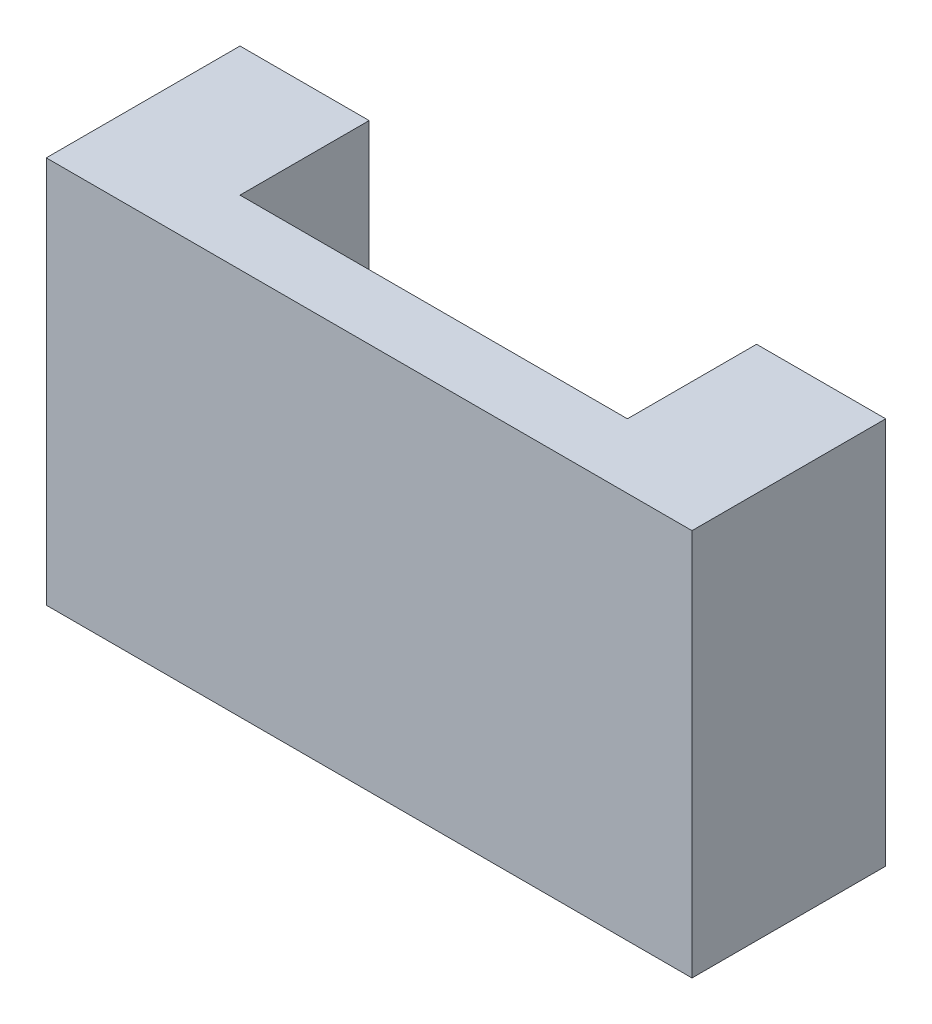
ISO-10303-21;
HEADER;
FILE_DESCRIPTION(('STEP AP214'),'2;1');
FILE_NAME('part.step','',(''),(''),'','','');
FILE_SCHEMA(('AUTOMOTIVE_DESIGN { 1 0 10303 214 1 1 1 1 }'));
ENDSEC;
DATA;
#1=APPLICATION_CONTEXT('core data for automotive mechanical design processes');
#2=APPLICATION_PROTOCOL_DEFINITION('international standard','automotive_design',2000,#1);
#3=PRODUCT_CONTEXT('',#1,'mechanical');
#4=PRODUCT('Part','Part','',(#3));
#5=PRODUCT_RELATED_PRODUCT_CATEGORY('part','',(#4));
#6=PRODUCT_DEFINITION_FORMATION('','',#4);
#7=PRODUCT_DEFINITION_CONTEXT('part definition',#1,'design');
#8=PRODUCT_DEFINITION('design','',#6,#7);
#9=PRODUCT_DEFINITION_SHAPE('','',#8);
#10=(LENGTH_UNIT() NAMED_UNIT(*) SI_UNIT(.MILLI.,.METRE.));
#11=(NAMED_UNIT(*) PLANE_ANGLE_UNIT() SI_UNIT($,.RADIAN.));
#12=(NAMED_UNIT(*) SI_UNIT($,.STERADIAN.) SOLID_ANGLE_UNIT());
#13=UNCERTAINTY_MEASURE_WITH_UNIT(LENGTH_MEASURE(1.E-05),#10,'distance_accuracy_value','');
#14=(GEOMETRIC_REPRESENTATION_CONTEXT(3) GLOBAL_UNCERTAINTY_ASSIGNED_CONTEXT((#13)) GLOBAL_UNIT_ASSIGNED_CONTEXT((#10,
#11,#12)) REPRESENTATION_CONTEXT('',''));
#15=CARTESIAN_POINT('',(0.,0.,0.));
#16=DIRECTION('',(0.,0.,1.));
#17=DIRECTION('',(1.,0.,0.));
#18=AXIS2_PLACEMENT_3D('',#15,#16,#17);
#19=CARTESIAN_POINT('',(-25.,30.,0.));
#20=DIRECTION('',(1.,0.,0.));
#21=DIRECTION('',(0.,0.,-1.));
#22=AXIS2_PLACEMENT_3D('',#19,#20,#21);
#23=PLANE('',#22);
#24=DIRECTION('',(0.,0.,1.));
#25=VECTOR('',#24,1.);
#26=CARTESIAN_POINT('',(-25.,0.,0.));
#27=LINE('',#26,#25);
#28=CARTESIAN_POINT('',(-25.,0.,0.));
#29=VERTEX_POINT('',#28);
#30=CARTESIAN_POINT('',(-25.,0.,15.));
#31=VERTEX_POINT('',#30);
#32=EDGE_CURVE('E140',#29,#31,#27,.T.);
#33=ORIENTED_EDGE('',*,*,#32,.T.);
#34=DIRECTION('',(0.,-1.,0.));
#35=VECTOR('',#34,1.);
#36=CARTESIAN_POINT('',(-25.,30.,15.));
#37=LINE('',#36,#35);
#38=CARTESIAN_POINT('',(-25.,30.,15.));
#39=VERTEX_POINT('',#38);
#40=EDGE_CURVE('E11',#39,#31,#37,.T.);
#41=ORIENTED_EDGE('',*,*,#40,.F.);
#42=DIRECTION('',(0.,0.,1.));
#43=VECTOR('',#42,1.);
#44=CARTESIAN_POINT('',(-25.,30.,0.));
#45=LINE('',#44,#43);
#46=CARTESIAN_POINT('',(-25.,30.,0.));
#47=VERTEX_POINT('',#46);
#48=EDGE_CURVE('E162',#47,#39,#45,.T.);
#49=ORIENTED_EDGE('',*,*,#48,.F.);
#50=DIRECTION('',(0.,-1.,0.));
#51=VECTOR('',#50,1.);
#52=CARTESIAN_POINT('',(-25.,30.,0.));
#53=LINE('',#52,#51);
#54=EDGE_CURVE('E136',#47,#29,#53,.T.);
#55=ORIENTED_EDGE('',*,*,#54,.T.);
#56=EDGE_LOOP('',(#33,#41,#49,#55));
#57=FACE_BOUND('',#56,.T.);
#58=ADVANCED_FACE('F39',(#57),#23,.F.);
#59=CARTESIAN_POINT('',(-25.,30.,15.));
#60=DIRECTION('',(0.,0.,-1.));
#61=DIRECTION('',(-1.,0.,0.));
#62=AXIS2_PLACEMENT_3D('',#59,#60,#61);
#63=PLANE('',#62);
#64=DIRECTION('',(1.,0.,0.));
#65=VECTOR('',#64,1.);
#66=CARTESIAN_POINT('',(-25.,0.,15.));
#67=LINE('',#66,#65);
#68=CARTESIAN_POINT('',(25.,0.,15.));
#69=VERTEX_POINT('',#68);
#70=EDGE_CURVE('E144',#31,#69,#67,.T.);
#71=ORIENTED_EDGE('',*,*,#70,.T.);
#72=DIRECTION('',(0.,-1.,0.));
#73=VECTOR('',#72,1.);
#74=CARTESIAN_POINT('',(25.,30.,15.));
#75=LINE('',#74,#73);
#76=CARTESIAN_POINT('',(25.,30.,15.));
#77=VERTEX_POINT('',#76);
#78=EDGE_CURVE('E48',#77,#69,#75,.T.);
#79=ORIENTED_EDGE('',*,*,#78,.F.);
#80=DIRECTION('',(1.,0.,0.));
#81=VECTOR('',#80,1.);
#82=CARTESIAN_POINT('',(-25.,30.,15.));
#83=LINE('',#82,#81);
#84=EDGE_CURVE('E99',#39,#77,#83,.T.);
#85=ORIENTED_EDGE('',*,*,#84,.F.);
#86=ORIENTED_EDGE('',*,*,#40,.T.);
#87=EDGE_LOOP('',(#71,#79,#85,#86));
#88=FACE_BOUND('',#87,.T.);
#89=ADVANCED_FACE('F208',(#88),#63,.F.);
#90=CARTESIAN_POINT('',(25.,30.,0.));
#91=DIRECTION('',(-1.,0.,0.));
#92=DIRECTION('',(0.,0.,1.));
#93=AXIS2_PLACEMENT_3D('',#90,#91,#92);
#94=PLANE('',#93);
#95=DIRECTION('',(0.,0.,-1.));
#96=VECTOR('',#95,1.);
#97=CARTESIAN_POINT('',(25.,0.,0.));
#98=LINE('',#97,#96);
#99=CARTESIAN_POINT('',(25.,0.,0.));
#100=VERTEX_POINT('',#99);
#101=EDGE_CURVE('E147',#69,#100,#98,.T.);
#102=ORIENTED_EDGE('',*,*,#101,.T.);
#103=DIRECTION('',(0.,-1.,0.));
#104=VECTOR('',#103,1.);
#105=CARTESIAN_POINT('',(25.,30.,0.));
#106=LINE('',#105,#104);
#107=CARTESIAN_POINT('',(25.,30.,0.));
#108=VERTEX_POINT('',#107);
#109=EDGE_CURVE('E173',#108,#100,#106,.T.);
#110=ORIENTED_EDGE('',*,*,#109,.F.);
#111=DIRECTION('',(0.,0.,-1.));
#112=VECTOR('',#111,1.);
#113=CARTESIAN_POINT('',(25.,30.,0.));
#114=LINE('',#113,#112);
#115=EDGE_CURVE('E183',#77,#108,#114,.T.);
#116=ORIENTED_EDGE('',*,*,#115,.F.);
#117=ORIENTED_EDGE('',*,*,#78,.T.);
#118=EDGE_LOOP('',(#102,#110,#116,#117));
#119=FACE_BOUND('',#118,.T.);
#120=ADVANCED_FACE('F181',(#119),#94,.F.);
#121=CARTESIAN_POINT('',(25.,30.,0.));
#122=DIRECTION('',(0.,0.,1.));
#123=DIRECTION('',(1.,0.,0.));
#124=AXIS2_PLACEMENT_3D('',#121,#122,#123);
#125=PLANE('',#124);
#126=DIRECTION('',(-1.,0.,0.));
#127=VECTOR('',#126,1.);
#128=CARTESIAN_POINT('',(25.,0.,0.));
#129=LINE('',#128,#127);
#130=CARTESIAN_POINT('',(15.,0.,0.));
#131=VERTEX_POINT('',#130);
#132=EDGE_CURVE('E150',#100,#131,#129,.T.);
#133=ORIENTED_EDGE('',*,*,#132,.T.);
#134=DIRECTION('',(0.,-1.,0.));
#135=VECTOR('',#134,1.);
#136=CARTESIAN_POINT('',(15.,30.,0.));
#137=LINE('',#136,#135);
#138=CARTESIAN_POINT('',(15.,30.,0.));
#139=VERTEX_POINT('',#138);
#140=EDGE_CURVE('E169',#139,#131,#137,.T.);
#141=ORIENTED_EDGE('',*,*,#140,.F.);
#142=DIRECTION('',(-1.,0.,0.));
#143=VECTOR('',#142,1.);
#144=CARTESIAN_POINT('',(25.,30.,0.));
#145=LINE('',#144,#143);
#146=EDGE_CURVE('E196',#108,#139,#145,.T.);
#147=ORIENTED_EDGE('',*,*,#146,.F.);
#148=ORIENTED_EDGE('',*,*,#109,.T.);
#149=EDGE_LOOP('',(#133,#141,#147,#148));
#150=FACE_BOUND('',#149,.T.);
#151=ADVANCED_FACE('F191',(#150),#125,.F.);
#152=CARTESIAN_POINT('',(15.,30.,0.));
#153=DIRECTION('',(1.,0.,0.));
#154=DIRECTION('',(0.,0.,-1.));
#155=AXIS2_PLACEMENT_3D('',#152,#153,#154);
#156=PLANE('',#155);
#157=DIRECTION('',(0.,0.,1.));
#158=VECTOR('',#157,1.);
#159=CARTESIAN_POINT('',(15.,0.,0.));
#160=LINE('',#159,#158);
#161=CARTESIAN_POINT('',(15.,0.,10.));
#162=VERTEX_POINT('',#161);
#163=EDGE_CURVE('E153',#131,#162,#160,.T.);
#164=ORIENTED_EDGE('',*,*,#163,.T.);
#165=DIRECTION('',(0.,-1.,0.));
#166=VECTOR('',#165,1.);
#167=CARTESIAN_POINT('',(15.,30.,10.));
#168=LINE('',#167,#166);
#169=CARTESIAN_POINT('',(15.,30.,10.));
#170=VERTEX_POINT('',#169);
#171=EDGE_CURVE('E129',#170,#162,#168,.T.);
#172=ORIENTED_EDGE('',*,*,#171,.F.);
#173=DIRECTION('',(0.,0.,1.));
#174=VECTOR('',#173,1.);
#175=CARTESIAN_POINT('',(15.,30.,0.));
#176=LINE('',#175,#174);
#177=EDGE_CURVE('E118',#139,#170,#176,.T.);
#178=ORIENTED_EDGE('',*,*,#177,.F.);
#179=ORIENTED_EDGE('',*,*,#140,.T.);
#180=EDGE_LOOP('',(#164,#172,#178,#179));
#181=FACE_BOUND('',#180,.T.);
#182=ADVANCED_FACE('F194',(#181),#156,.F.);
#183=CARTESIAN_POINT('',(-15.,30.,10.));
#184=DIRECTION('',(0.,0.,1.));
#185=DIRECTION('',(1.,0.,0.));
#186=AXIS2_PLACEMENT_3D('',#183,#184,#185);
#187=PLANE('',#186);
#188=DIRECTION('',(-1.,0.,0.));
#189=VECTOR('',#188,1.);
#190=CARTESIAN_POINT('',(-15.,0.,10.));
#191=LINE('',#190,#189);
#192=CARTESIAN_POINT('',(-15.,0.,10.));
#193=VERTEX_POINT('',#192);
#194=EDGE_CURVE('E127',#162,#193,#191,.T.);
#195=ORIENTED_EDGE('',*,*,#194,.T.);
#196=DIRECTION('',(0.,-1.,0.));
#197=VECTOR('',#196,1.);
#198=CARTESIAN_POINT('',(-15.,30.,10.));
#199=LINE('',#198,#197);
#200=CARTESIAN_POINT('',(-15.,30.,10.));
#201=VERTEX_POINT('',#200);
#202=EDGE_CURVE('E124',#201,#193,#199,.T.);
#203=ORIENTED_EDGE('',*,*,#202,.F.);
#204=DIRECTION('',(-1.,0.,0.));
#205=VECTOR('',#204,1.);
#206=CARTESIAN_POINT('',(-15.,30.,10.));
#207=LINE('',#206,#205);
#208=EDGE_CURVE('E112',#170,#201,#207,.T.);
#209=ORIENTED_EDGE('',*,*,#208,.F.);
#210=ORIENTED_EDGE('',*,*,#171,.T.);
#211=EDGE_LOOP('',(#195,#203,#209,#210));
#212=FACE_BOUND('',#211,.T.);
#213=ADVANCED_FACE('F125',(#212),#187,.F.);
#214=CARTESIAN_POINT('',(-15.,30.,0.));
#215=DIRECTION('',(-1.,0.,0.));
#216=DIRECTION('',(0.,0.,1.));
#217=AXIS2_PLACEMENT_3D('',#214,#215,#216);
#218=PLANE('',#217);
#219=DIRECTION('',(0.,0.,-1.));
#220=VECTOR('',#219,1.);
#221=CARTESIAN_POINT('',(-15.,0.,0.));
#222=LINE('',#221,#220);
#223=CARTESIAN_POINT('',(-15.,0.,0.));
#224=VERTEX_POINT('',#223);
#225=EDGE_CURVE('E85',#193,#224,#222,.T.);
#226=ORIENTED_EDGE('',*,*,#225,.T.);
#227=DIRECTION('',(0.,-1.,0.));
#228=VECTOR('',#227,1.);
#229=CARTESIAN_POINT('',(-15.,30.,0.));
#230=LINE('',#229,#228);
#231=CARTESIAN_POINT('',(-15.,30.,0.));
#232=VERTEX_POINT('',#231);
#233=EDGE_CURVE('E130',#232,#224,#230,.T.);
#234=ORIENTED_EDGE('',*,*,#233,.F.);
#235=DIRECTION('',(0.,0.,-1.));
#236=VECTOR('',#235,1.);
#237=CARTESIAN_POINT('',(-15.,30.,0.));
#238=LINE('',#237,#236);
#239=EDGE_CURVE('E116',#201,#232,#238,.T.);
#240=ORIENTED_EDGE('',*,*,#239,.F.);
#241=ORIENTED_EDGE('',*,*,#202,.T.);
#242=EDGE_LOOP('',(#226,#234,#240,#241));
#243=FACE_BOUND('',#242,.T.);
#244=ADVANCED_FACE('F132',(#243),#218,.F.);
#245=CARTESIAN_POINT('',(-25.,30.,0.));
#246=DIRECTION('',(0.,0.,1.));
#247=DIRECTION('',(1.,0.,0.));
#248=AXIS2_PLACEMENT_3D('',#245,#246,#247);
#249=PLANE('',#248);
#250=DIRECTION('',(-1.,0.,0.));
#251=VECTOR('',#250,1.);
#252=CARTESIAN_POINT('',(-25.,0.,0.));
#253=LINE('',#252,#251);
#254=EDGE_CURVE('E91',#224,#29,#253,.T.);
#255=ORIENTED_EDGE('',*,*,#254,.T.);
#256=ORIENTED_EDGE('',*,*,#54,.F.);
#257=DIRECTION('',(-1.,0.,0.));
#258=VECTOR('',#257,1.);
#259=CARTESIAN_POINT('',(-25.,30.,0.));
#260=LINE('',#259,#258);
#261=EDGE_CURVE('E56',#232,#47,#260,.T.);
#262=ORIENTED_EDGE('',*,*,#261,.F.);
#263=ORIENTED_EDGE('',*,*,#233,.T.);
#264=EDGE_LOOP('',(#255,#256,#262,#263));
#265=FACE_BOUND('',#264,.T.);
#266=ADVANCED_FACE('F224',(#265),#249,.F.);
#267=CARTESIAN_POINT('',(0.,30.,0.));
#268=DIRECTION('',(0.,1.,0.));
#269=DIRECTION('',(0.,0.,1.));
#270=AXIS2_PLACEMENT_3D('',#267,#268,#269);
#271=PLANE('',#270);
#272=ORIENTED_EDGE('',*,*,#48,.T.);
#273=ORIENTED_EDGE('',*,*,#84,.T.);
#274=ORIENTED_EDGE('',*,*,#115,.T.);
#275=ORIENTED_EDGE('',*,*,#146,.T.);
#276=ORIENTED_EDGE('',*,*,#177,.T.);
#277=ORIENTED_EDGE('',*,*,#208,.T.);
#278=ORIENTED_EDGE('',*,*,#239,.T.);
#279=ORIENTED_EDGE('',*,*,#261,.T.);
#280=EDGE_LOOP('',(#272,#273,#274,#275,#276,#277,#278,#279));
#281=FACE_BOUND('',#280,.T.);
#282=ADVANCED_FACE('F114',(#281),#271,.T.);
#283=CARTESIAN_POINT('',(0.,0.,0.));
#284=DIRECTION('',(0.,1.,0.));
#285=DIRECTION('',(0.,0.,1.));
#286=AXIS2_PLACEMENT_3D('',#283,#284,#285);
#287=PLANE('',#286);
#288=ORIENTED_EDGE('',*,*,#32,.F.);
#289=ORIENTED_EDGE('',*,*,#254,.F.);
#290=ORIENTED_EDGE('',*,*,#225,.F.);
#291=ORIENTED_EDGE('',*,*,#194,.F.);
#292=ORIENTED_EDGE('',*,*,#163,.F.);
#293=ORIENTED_EDGE('',*,*,#132,.F.);
#294=ORIENTED_EDGE('',*,*,#101,.F.);
#295=ORIENTED_EDGE('',*,*,#70,.F.);
#296=EDGE_LOOP('',(#288,#289,#290,#291,#292,#293,#294,#295));
#297=FACE_BOUND('',#296,.T.);
#298=ADVANCED_FACE('F187',(#297),#287,.F.);
#299=CLOSED_SHELL('',(#58,#89,#120,#151,#182,#213,#244,#266,#282,#298));
#300=MANIFOLD_SOLID_BREP('B2',#299);
#301=ADVANCED_BREP_SHAPE_REPRESENTATION('',(#18,#300),#14);
#302=SHAPE_DEFINITION_REPRESENTATION(#9,#301);
ENDSEC;
END-ISO-10303-21;
